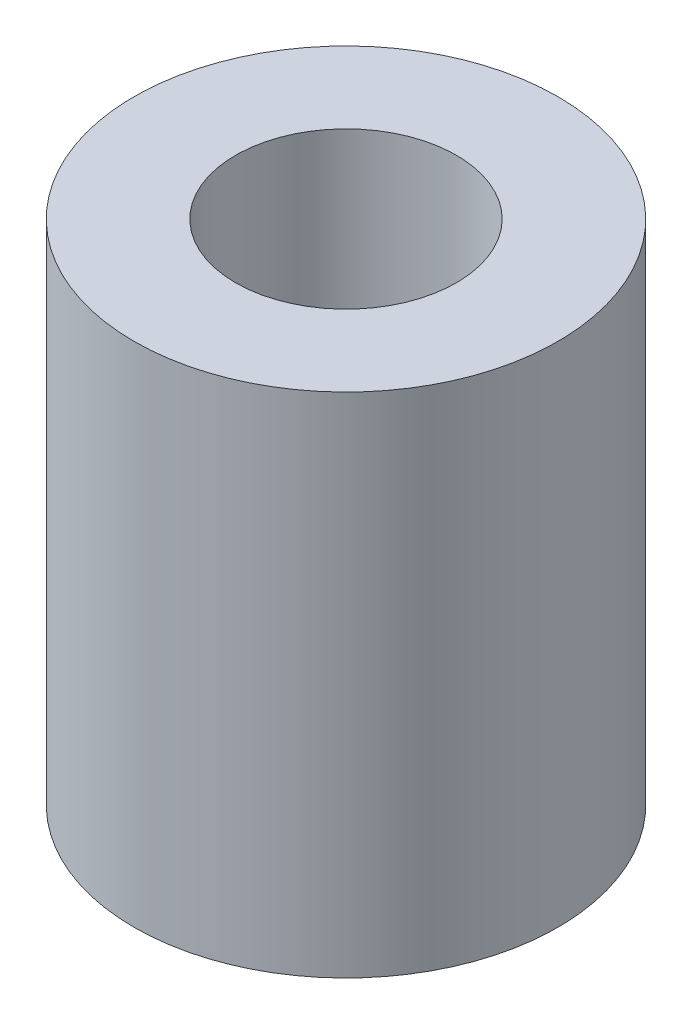
ISO-10303-21;
HEADER;
FILE_DESCRIPTION(('STEP AP214'),'2;1');
FILE_NAME('part.step','',(''),(''),'','','');
FILE_SCHEMA(('AUTOMOTIVE_DESIGN { 1 0 10303 214 1 1 1 1 }'));
ENDSEC;
DATA;
#1=APPLICATION_CONTEXT('core data for automotive mechanical design processes');
#2=APPLICATION_PROTOCOL_DEFINITION('international standard','automotive_design',2000,#1);
#3=PRODUCT_CONTEXT('',#1,'mechanical');
#4=PRODUCT('Part','Part','',(#3));
#5=PRODUCT_RELATED_PRODUCT_CATEGORY('part','',(#4));
#6=PRODUCT_DEFINITION_FORMATION('','',#4);
#7=PRODUCT_DEFINITION_CONTEXT('part definition',#1,'design');
#8=PRODUCT_DEFINITION('design','',#6,#7);
#9=PRODUCT_DEFINITION_SHAPE('','',#8);
#10=(LENGTH_UNIT() NAMED_UNIT(*) SI_UNIT(.MILLI.,.METRE.));
#11=(NAMED_UNIT(*) PLANE_ANGLE_UNIT() SI_UNIT($,.RADIAN.));
#12=(NAMED_UNIT(*) SI_UNIT($,.STERADIAN.) SOLID_ANGLE_UNIT());
#13=UNCERTAINTY_MEASURE_WITH_UNIT(LENGTH_MEASURE(1.E-05),#10,'distance_accuracy_value','');
#14=(GEOMETRIC_REPRESENTATION_CONTEXT(3) GLOBAL_UNCERTAINTY_ASSIGNED_CONTEXT((#13)) GLOBAL_UNIT_ASSIGNED_CONTEXT((#10,
#11,#12)) REPRESENTATION_CONTEXT('',''));
#15=CARTESIAN_POINT('',(0.,0.,0.));
#16=DIRECTION('',(0.,0.,1.));
#17=DIRECTION('',(1.,0.,0.));
#18=AXIS2_PLACEMENT_3D('',#15,#16,#17);
#19=CARTESIAN_POINT('',(-0.33444270414617,21.59,-0.106835863824471));
#20=DIRECTION('',(0.,1.,0.));
#21=DIRECTION('',(0.,0.,1.));
#22=AXIS2_PLACEMENT_3D('',#19,#20,#21);
#23=PLANE('',#22);
#24=CARTESIAN_POINT('',(-0.33444270414617,21.59,-0.106835863824471));
#25=DIRECTION('',(0.,1.,0.));
#26=DIRECTION('',(0.,0.,1.));
#27=AXIS2_PLACEMENT_3D('',#24,#25,#26);
#28=CIRCLE('',#27,9.017);
#29=CARTESIAN_POINT('',(-0.33444270414617,21.59,8.91016413617553));
#30=VERTEX_POINT('',#29);
#31=EDGE_CURVE('E10',#30,#30,#28,.T.);
#32=ORIENTED_EDGE('',*,*,#31,.T.);
#33=EDGE_LOOP('',(#32));
#34=FACE_BOUND('',#33,.T.);
#35=CARTESIAN_POINT('',(-0.33444270414617,21.59,-0.106835863824471));
#36=DIRECTION('',(0.,1.,0.));
#37=DIRECTION('',(0.,0.,1.));
#38=AXIS2_PLACEMENT_3D('',#35,#36,#37);
#39=CIRCLE('',#38,4.699);
#40=CARTESIAN_POINT('',(-0.33444270414617,21.59,4.59216413617553));
#41=VERTEX_POINT('',#40);
#42=EDGE_CURVE('E52',#41,#41,#39,.T.);
#43=ORIENTED_EDGE('',*,*,#42,.F.);
#44=EDGE_LOOP('',(#43));
#45=FACE_BOUND('',#44,.T.);
#46=ADVANCED_FACE('F41',(#34,#45),#23,.T.);
#47=CARTESIAN_POINT('',(-0.33444270414617,0.,-0.106835863824471));
#48=DIRECTION('',(0.,1.,0.));
#49=DIRECTION('',(0.,0.,1.));
#50=AXIS2_PLACEMENT_3D('',#47,#48,#49);
#51=PLANE('',#50);
#52=CARTESIAN_POINT('',(-0.33444270414617,0.,-0.106835863824471));
#53=DIRECTION('',(0.,1.,0.));
#54=DIRECTION('',(0.,0.,1.));
#55=AXIS2_PLACEMENT_3D('',#52,#53,#54);
#56=CIRCLE('',#55,9.017);
#57=CARTESIAN_POINT('',(-0.33444270414617,0.,8.91016413617553));
#58=VERTEX_POINT('',#57);
#59=EDGE_CURVE('E45',#58,#58,#56,.T.);
#60=ORIENTED_EDGE('',*,*,#59,.F.);
#61=EDGE_LOOP('',(#60));
#62=FACE_BOUND('',#61,.T.);
#63=CARTESIAN_POINT('',(-0.33444270414617,0.,-0.106835863824471));
#64=DIRECTION('',(0.,1.,0.));
#65=DIRECTION('',(0.,0.,1.));
#66=AXIS2_PLACEMENT_3D('',#63,#64,#65);
#67=CIRCLE('',#66,4.699);
#68=CARTESIAN_POINT('',(-0.33444270414617,0.,4.59216413617553));
#69=VERTEX_POINT('',#68);
#70=EDGE_CURVE('E54',#69,#69,#67,.T.);
#71=ORIENTED_EDGE('',*,*,#70,.T.);
#72=EDGE_LOOP('',(#71));
#73=FACE_BOUND('',#72,.T.);
#74=ADVANCED_FACE('F64',(#62,#73),#51,.F.);
#75=CARTESIAN_POINT('',(-0.33444270414617,21.59,-0.106835863824471));
#76=DIRECTION('',(0.,-1.,0.));
#77=DIRECTION('',(0.,0.,-1.));
#78=AXIS2_PLACEMENT_3D('',#75,#76,#77);
#79=CYLINDRICAL_SURFACE('',#78,9.017);
#80=ORIENTED_EDGE('',*,*,#31,.F.);
#81=EDGE_LOOP('',(#80));
#82=FACE_BOUND('',#81,.T.);
#83=ORIENTED_EDGE('',*,*,#59,.T.);
#84=EDGE_LOOP('',(#83));
#85=FACE_BOUND('',#84,.T.);
#86=ADVANCED_FACE('F43',(#82,#85),#79,.T.);
#87=CARTESIAN_POINT('',(-0.33444270414617,21.59,-0.106835863824471));
#88=DIRECTION('',(0.,-1.,0.));
#89=DIRECTION('',(0.,0.,-1.));
#90=AXIS2_PLACEMENT_3D('',#87,#88,#89);
#91=CYLINDRICAL_SURFACE('',#90,4.699);
#92=ORIENTED_EDGE('',*,*,#42,.T.);
#93=EDGE_LOOP('',(#92));
#94=FACE_BOUND('',#93,.T.);
#95=ORIENTED_EDGE('',*,*,#70,.F.);
#96=EDGE_LOOP('',(#95));
#97=FACE_BOUND('',#96,.T.);
#98=ADVANCED_FACE('F60',(#94,#97),#91,.F.);
#99=CLOSED_SHELL('',(#46,#74,#86,#98));
#100=MANIFOLD_SOLID_BREP('B2',#99);
#101=ADVANCED_BREP_SHAPE_REPRESENTATION('',(#18,#100),#14);
#102=SHAPE_DEFINITION_REPRESENTATION(#9,#101);
ENDSEC;
END-ISO-10303-21;
